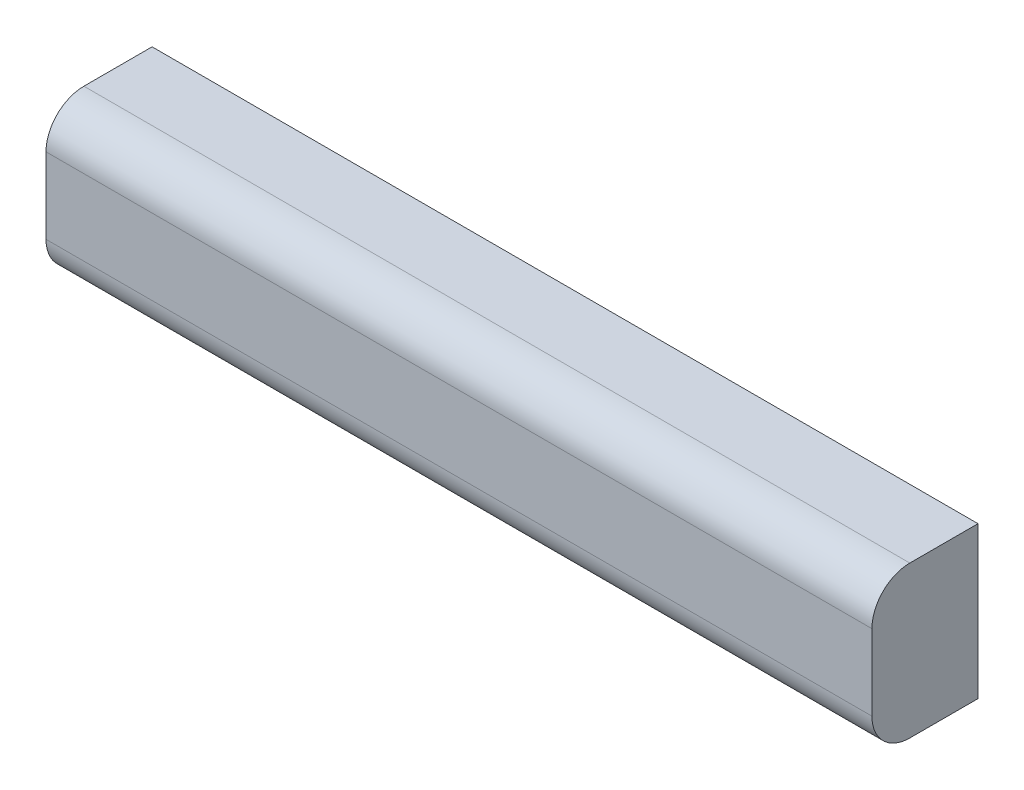
ISO-10303-21;
HEADER;
FILE_DESCRIPTION(('STEP AP214'),'2;1');
FILE_NAME('part.step','',(''),(''),'','','');
FILE_SCHEMA(('AUTOMOTIVE_DESIGN { 1 0 10303 214 1 1 1 1 }'));
ENDSEC;
DATA;
#1=APPLICATION_CONTEXT('core data for automotive mechanical design processes');
#2=APPLICATION_PROTOCOL_DEFINITION('international standard','automotive_design',2000,#1);
#3=PRODUCT_CONTEXT('',#1,'mechanical');
#4=PRODUCT('Part','Part','',(#3));
#5=PRODUCT_RELATED_PRODUCT_CATEGORY('part','',(#4));
#6=PRODUCT_DEFINITION_FORMATION('','',#4);
#7=PRODUCT_DEFINITION_CONTEXT('part definition',#1,'design');
#8=PRODUCT_DEFINITION('design','',#6,#7);
#9=PRODUCT_DEFINITION_SHAPE('','',#8);
#10=(LENGTH_UNIT() NAMED_UNIT(*) SI_UNIT(.MILLI.,.METRE.));
#11=(NAMED_UNIT(*) PLANE_ANGLE_UNIT() SI_UNIT($,.RADIAN.));
#12=(NAMED_UNIT(*) SI_UNIT($,.STERADIAN.) SOLID_ANGLE_UNIT());
#13=UNCERTAINTY_MEASURE_WITH_UNIT(LENGTH_MEASURE(1.E-05),#10,'distance_accuracy_value','');
#14=(GEOMETRIC_REPRESENTATION_CONTEXT(3) GLOBAL_UNCERTAINTY_ASSIGNED_CONTEXT((#13)) GLOBAL_UNIT_ASSIGNED_CONTEXT((#10,
#11,#12)) REPRESENTATION_CONTEXT('',''));
#15=CARTESIAN_POINT('',(0.,0.,0.));
#16=DIRECTION('',(0.,0.,1.));
#17=DIRECTION('',(1.,0.,0.));
#18=AXIS2_PLACEMENT_3D('',#15,#16,#17);
#19=CARTESIAN_POINT('',(346.075,63.5,44.45));
#20=DIRECTION('',(-1.,0.,0.));
#21=DIRECTION('',(0.,0.,1.));
#22=AXIS2_PLACEMENT_3D('',#19,#20,#21);
#23=PLANE('',#22);
#24=DIRECTION('',(0.,1.,0.));
#25=VECTOR('',#24,1.);
#26=CARTESIAN_POINT('',(346.075,63.5,44.45));
#27=LINE('',#26,#25);
#28=CARTESIAN_POINT('',(346.075,-31.75,44.45));
#29=VERTEX_POINT('',#28);
#30=CARTESIAN_POINT('',(346.075,31.75,44.45));
#31=VERTEX_POINT('',#30);
#32=EDGE_CURVE('E121',#29,#31,#27,.T.);
#33=ORIENTED_EDGE('',*,*,#32,.F.);
#34=CARTESIAN_POINT('',(346.075,-31.75,12.7));
#35=DIRECTION('',(-1.,0.,0.));
#36=DIRECTION('',(0.,0.,1.));
#37=AXIS2_PLACEMENT_3D('',#34,#35,#36);
#38=CIRCLE('',#37,31.75);
#39=CARTESIAN_POINT('',(346.075,-63.5,12.7));
#40=VERTEX_POINT('',#39);
#41=EDGE_CURVE('E133',#29,#40,#38,.F.);
#42=ORIENTED_EDGE('',*,*,#41,.T.);
#43=DIRECTION('',(0.,0.,-1.));
#44=VECTOR('',#43,1.);
#45=CARTESIAN_POINT('',(346.075,-63.5,44.45));
#46=LINE('',#45,#44);
#47=CARTESIAN_POINT('',(346.075,-63.5,-44.45));
#48=VERTEX_POINT('',#47);
#49=EDGE_CURVE('E107',#40,#48,#46,.T.);
#50=ORIENTED_EDGE('',*,*,#49,.T.);
#51=DIRECTION('',(0.,1.,0.));
#52=VECTOR('',#51,1.);
#53=CARTESIAN_POINT('',(346.075,63.5,-44.45));
#54=LINE('',#53,#52);
#55=CARTESIAN_POINT('',(346.075,63.5,-44.45));
#56=VERTEX_POINT('',#55);
#57=EDGE_CURVE('E102',#48,#56,#54,.T.);
#58=ORIENTED_EDGE('',*,*,#57,.T.);
#59=DIRECTION('',(0.,0.,-1.));
#60=VECTOR('',#59,1.);
#61=CARTESIAN_POINT('',(346.075,63.5,44.45));
#62=LINE('',#61,#60);
#63=CARTESIAN_POINT('',(346.075,63.5,12.7));
#64=VERTEX_POINT('',#63);
#65=EDGE_CURVE('E86',#64,#56,#62,.T.);
#66=ORIENTED_EDGE('',*,*,#65,.F.);
#67=CARTESIAN_POINT('',(346.075,31.75,12.7));
#68=DIRECTION('',(-1.,0.,0.));
#69=DIRECTION('',(0.,0.,1.));
#70=AXIS2_PLACEMENT_3D('',#67,#68,#69);
#71=CIRCLE('',#70,31.75);
#72=EDGE_CURVE('E131',#64,#31,#71,.F.);
#73=ORIENTED_EDGE('',*,*,#72,.T.);
#74=EDGE_LOOP('',(#33,#42,#50,#58,#66,#73));
#75=FACE_BOUND('',#74,.T.);
#76=ADVANCED_FACE('F33',(#75),#23,.F.);
#77=CARTESIAN_POINT('',(-346.075,63.5,44.45));
#78=DIRECTION('',(0.,-1.,0.));
#79=DIRECTION('',(0.,0.,-1.));
#80=AXIS2_PLACEMENT_3D('',#77,#78,#79);
#81=PLANE('',#80);
#82=DIRECTION('',(0.,0.,-1.));
#83=VECTOR('',#82,1.);
#84=CARTESIAN_POINT('',(-346.075,63.5,44.45));
#85=LINE('',#84,#83);
#86=CARTESIAN_POINT('',(-346.075,63.5,12.7));
#87=VERTEX_POINT('',#86);
#88=CARTESIAN_POINT('',(-346.075,63.5,-44.45));
#89=VERTEX_POINT('',#88);
#90=EDGE_CURVE('E96',#87,#89,#85,.T.);
#91=ORIENTED_EDGE('',*,*,#90,.F.);
#92=DIRECTION('',(-1.,0.,0.));
#93=VECTOR('',#92,1.);
#94=CARTESIAN_POINT('',(346.075,63.5,12.7));
#95=LINE('',#94,#93);
#96=EDGE_CURVE('E11',#87,#64,#95,.F.);
#97=ORIENTED_EDGE('',*,*,#96,.T.);
#98=ORIENTED_EDGE('',*,*,#65,.T.);
#99=DIRECTION('',(-1.,0.,0.));
#100=VECTOR('',#99,1.);
#101=CARTESIAN_POINT('',(-346.075,63.5,-44.45));
#102=LINE('',#101,#100);
#103=EDGE_CURVE('E89',#56,#89,#102,.T.);
#104=ORIENTED_EDGE('',*,*,#103,.T.);
#105=EDGE_LOOP('',(#91,#97,#98,#104));
#106=FACE_BOUND('',#105,.T.);
#107=ADVANCED_FACE('F88',(#106),#81,.F.);
#108=CARTESIAN_POINT('',(-346.075,63.5,44.45));
#109=DIRECTION('',(1.,0.,0.));
#110=DIRECTION('',(0.,0.,-1.));
#111=AXIS2_PLACEMENT_3D('',#108,#109,#110);
#112=PLANE('',#111);
#113=DIRECTION('',(0.,0.,-1.));
#114=VECTOR('',#113,1.);
#115=CARTESIAN_POINT('',(-346.075,-63.5,44.45));
#116=LINE('',#115,#114);
#117=CARTESIAN_POINT('',(-346.075,-63.5,12.7));
#118=VERTEX_POINT('',#117);
#119=CARTESIAN_POINT('',(-346.075,-63.5,-44.45));
#120=VERTEX_POINT('',#119);
#121=EDGE_CURVE('E123',#118,#120,#116,.T.);
#122=ORIENTED_EDGE('',*,*,#121,.F.);
#123=CARTESIAN_POINT('',(-346.075,-31.75,12.7));
#124=DIRECTION('',(1.,0.,0.));
#125=DIRECTION('',(0.,0.,-1.));
#126=AXIS2_PLACEMENT_3D('',#123,#124,#125);
#127=CIRCLE('',#126,31.75);
#128=CARTESIAN_POINT('',(-346.075,-31.75,44.45));
#129=VERTEX_POINT('',#128);
#130=EDGE_CURVE('E41',#118,#129,#127,.F.);
#131=ORIENTED_EDGE('',*,*,#130,.T.);
#132=DIRECTION('',(0.,-1.,0.));
#133=VECTOR('',#132,1.);
#134=CARTESIAN_POINT('',(-346.075,63.5,44.45));
#135=LINE('',#134,#133);
#136=CARTESIAN_POINT('',(-346.075,31.75,44.45));
#137=VERTEX_POINT('',#136);
#138=EDGE_CURVE('E115',#137,#129,#135,.T.);
#139=ORIENTED_EDGE('',*,*,#138,.F.);
#140=CARTESIAN_POINT('',(-346.075,31.75,12.7));
#141=DIRECTION('',(1.,0.,0.));
#142=DIRECTION('',(0.,0.,-1.));
#143=AXIS2_PLACEMENT_3D('',#140,#141,#142);
#144=CIRCLE('',#143,31.75);
#145=EDGE_CURVE('E48',#137,#87,#144,.F.);
#146=ORIENTED_EDGE('',*,*,#145,.T.);
#147=ORIENTED_EDGE('',*,*,#90,.T.);
#148=DIRECTION('',(0.,-1.,0.));
#149=VECTOR('',#148,1.);
#150=CARTESIAN_POINT('',(-346.075,63.5,-44.45));
#151=LINE('',#150,#149);
#152=EDGE_CURVE('E104',#89,#120,#151,.T.);
#153=ORIENTED_EDGE('',*,*,#152,.T.);
#154=EDGE_LOOP('',(#122,#131,#139,#146,#147,#153));
#155=FACE_BOUND('',#154,.T.);
#156=ADVANCED_FACE('F138',(#155),#112,.F.);
#157=CARTESIAN_POINT('',(-346.075,-63.5,44.45));
#158=DIRECTION('',(0.,1.,0.));
#159=DIRECTION('',(0.,0.,1.));
#160=AXIS2_PLACEMENT_3D('',#157,#158,#159);
#161=PLANE('',#160);
#162=ORIENTED_EDGE('',*,*,#49,.F.);
#163=DIRECTION('',(1.,0.,0.));
#164=VECTOR('',#163,1.);
#165=CARTESIAN_POINT('',(-346.075,-63.5,12.7));
#166=LINE('',#165,#164);
#167=EDGE_CURVE('E56',#40,#118,#166,.F.);
#168=ORIENTED_EDGE('',*,*,#167,.T.);
#169=ORIENTED_EDGE('',*,*,#121,.T.);
#170=DIRECTION('',(1.,0.,0.));
#171=VECTOR('',#170,1.);
#172=CARTESIAN_POINT('',(-346.075,-63.5,-44.45));
#173=LINE('',#172,#171);
#174=EDGE_CURVE('E119',#120,#48,#173,.T.);
#175=ORIENTED_EDGE('',*,*,#174,.T.);
#176=EDGE_LOOP('',(#162,#168,#169,#175));
#177=FACE_BOUND('',#176,.T.);
#178=ADVANCED_FACE('F146',(#177),#161,.F.);
#179=CARTESIAN_POINT('',(0.,0.,44.45));
#180=DIRECTION('',(0.,0.,1.));
#181=DIRECTION('',(1.,0.,0.));
#182=AXIS2_PLACEMENT_3D('',#179,#180,#181);
#183=PLANE('',#182);
#184=ORIENTED_EDGE('',*,*,#138,.T.);
#185=DIRECTION('',(1.,0.,0.));
#186=VECTOR('',#185,1.);
#187=CARTESIAN_POINT('',(346.075,-31.75,44.45));
#188=LINE('',#187,#186);
#189=EDGE_CURVE('E128',#129,#29,#188,.T.);
#190=ORIENTED_EDGE('',*,*,#189,.T.);
#191=ORIENTED_EDGE('',*,*,#32,.T.);
#192=DIRECTION('',(-1.,0.,0.));
#193=VECTOR('',#192,1.);
#194=CARTESIAN_POINT('',(-346.075,31.75,44.45));
#195=LINE('',#194,#193);
#196=EDGE_CURVE('E95',#31,#137,#195,.T.);
#197=ORIENTED_EDGE('',*,*,#196,.T.);
#198=EDGE_LOOP('',(#184,#190,#191,#197));
#199=FACE_BOUND('',#198,.T.);
#200=ADVANCED_FACE('F142',(#199),#183,.T.);
#201=CARTESIAN_POINT('',(0.,0.,-44.45));
#202=DIRECTION('',(0.,0.,1.));
#203=DIRECTION('',(1.,0.,0.));
#204=AXIS2_PLACEMENT_3D('',#201,#202,#203);
#205=PLANE('',#204);
#206=CARTESIAN_POINT('',(-183.367933996516,0.,-44.45));
#207=DIRECTION('',(0.,0.,-1.));
#208=DIRECTION('',(1.,0.,0.));
#209=AXIS2_PLACEMENT_3D('',#206,#207,#208);
#210=CIRCLE('',#209,4.76250000000001);
#211=CARTESIAN_POINT('',(-178.605433996516,0.,-44.45));
#212=VERTEX_POINT('',#211);
#213=EDGE_CURVE('E176',#212,#212,#210,.T.);
#214=ORIENTED_EDGE('',*,*,#213,.F.);
#215=EDGE_LOOP('',(#214));
#216=FACE_BOUND('',#215,.T.);
#217=CARTESIAN_POINT('',(183.367933996516,0.,-44.45));
#218=DIRECTION('',(0.,0.,-1.));
#219=DIRECTION('',(-1.,0.,0.));
#220=AXIS2_PLACEMENT_3D('',#217,#218,#219);
#221=CIRCLE('',#220,4.76250000000001);
#222=CARTESIAN_POINT('',(178.605433996516,0.,-44.45));
#223=VERTEX_POINT('',#222);
#224=EDGE_CURVE('E170',#223,#223,#221,.T.);
#225=ORIENTED_EDGE('',*,*,#224,.F.);
#226=EDGE_LOOP('',(#225));
#227=FACE_BOUND('',#226,.T.);
#228=CARTESIAN_POINT('',(157.967933996516,0.,-44.45));
#229=DIRECTION('',(0.,0.,-1.));
#230=DIRECTION('',(-1.,0.,0.));
#231=AXIS2_PLACEMENT_3D('',#228,#229,#230);
#232=CIRCLE('',#231,4.76250000000001);
#233=CARTESIAN_POINT('',(153.205433996516,0.,-44.45));
#234=VERTEX_POINT('',#233);
#235=EDGE_CURVE('E164',#234,#234,#232,.T.);
#236=ORIENTED_EDGE('',*,*,#235,.F.);
#237=EDGE_LOOP('',(#236));
#238=FACE_BOUND('',#237,.T.);
#239=CARTESIAN_POINT('',(-157.967933996516,0.,-44.45));
#240=DIRECTION('',(0.,0.,-1.));
#241=DIRECTION('',(1.,0.,0.));
#242=AXIS2_PLACEMENT_3D('',#239,#240,#241);
#243=CIRCLE('',#242,4.76250000000001);
#244=CARTESIAN_POINT('',(-153.205433996516,0.,-44.45));
#245=VERTEX_POINT('',#244);
#246=EDGE_CURVE('E158',#245,#245,#243,.T.);
#247=ORIENTED_EDGE('',*,*,#246,.F.);
#248=EDGE_LOOP('',(#247));
#249=FACE_BOUND('',#248,.T.);
#250=CARTESIAN_POINT('',(12.7,0.,-44.45));
#251=DIRECTION('',(0.,0.,-1.));
#252=DIRECTION('',(-1.,0.,0.));
#253=AXIS2_PLACEMENT_3D('',#250,#251,#252);
#254=CIRCLE('',#253,4.7625);
#255=CARTESIAN_POINT('',(7.9375,0.,-44.45));
#256=VERTEX_POINT('',#255);
#257=EDGE_CURVE('E152',#256,#256,#254,.T.);
#258=ORIENTED_EDGE('',*,*,#257,.F.);
#259=EDGE_LOOP('',(#258));
#260=FACE_BOUND('',#259,.T.);
#261=CARTESIAN_POINT('',(-12.7,0.,-44.45));
#262=DIRECTION('',(0.,0.,-1.));
#263=DIRECTION('',(-1.,0.,0.));
#264=AXIS2_PLACEMENT_3D('',#261,#262,#263);
#265=CIRCLE('',#264,4.7625);
#266=CARTESIAN_POINT('',(-17.4625,0.,-44.45));
#267=VERTEX_POINT('',#266);
#268=EDGE_CURVE('E112',#267,#267,#265,.T.);
#269=ORIENTED_EDGE('',*,*,#268,.F.);
#270=EDGE_LOOP('',(#269));
#271=FACE_BOUND('',#270,.T.);
#272=ORIENTED_EDGE('',*,*,#57,.F.);
#273=ORIENTED_EDGE('',*,*,#174,.F.);
#274=ORIENTED_EDGE('',*,*,#152,.F.);
#275=ORIENTED_EDGE('',*,*,#103,.F.);
#276=EDGE_LOOP('',(#272,#273,#274,#275));
#277=FACE_BOUND('',#276,.T.);
#278=ADVANCED_FACE('F100',(#216,#227,#238,#249,#260,#271,#277),#205,.F.);
#279=CARTESIAN_POINT('',(0.,-31.75,12.7));
#280=DIRECTION('',(-1.,0.,0.));
#281=DIRECTION('',(0.,0.,1.));
#282=AXIS2_PLACEMENT_3D('',#279,#280,#281);
#283=CYLINDRICAL_SURFACE('',#282,31.75);
#284=ORIENTED_EDGE('',*,*,#130,.F.);
#285=ORIENTED_EDGE('',*,*,#167,.F.);
#286=ORIENTED_EDGE('',*,*,#41,.F.);
#287=ORIENTED_EDGE('',*,*,#189,.F.);
#288=EDGE_LOOP('',(#284,#285,#286,#287));
#289=FACE_BOUND('',#288,.T.);
#290=ADVANCED_FACE('F145',(#289),#283,.T.);
#291=CARTESIAN_POINT('',(0.,31.75,12.7));
#292=DIRECTION('',(1.,0.,0.));
#293=DIRECTION('',(0.,0.,-1.));
#294=AXIS2_PLACEMENT_3D('',#291,#292,#293);
#295=CYLINDRICAL_SURFACE('',#294,31.75);
#296=ORIENTED_EDGE('',*,*,#72,.F.);
#297=ORIENTED_EDGE('',*,*,#96,.F.);
#298=ORIENTED_EDGE('',*,*,#145,.F.);
#299=ORIENTED_EDGE('',*,*,#196,.F.);
#300=EDGE_LOOP('',(#296,#297,#298,#299));
#301=FACE_BOUND('',#300,.T.);
#302=ADVANCED_FACE('F35',(#301),#295,.T.);
#303=CARTESIAN_POINT('',(-12.7,0.,-19.05));
#304=DIRECTION('',(0.,0.,-1.));
#305=DIRECTION('',(-1.,0.,0.));
#306=AXIS2_PLACEMENT_3D('',#303,#304,#305);
#307=CYLINDRICAL_SURFACE('',#306,4.7625);
#308=CARTESIAN_POINT('',(-12.7,0.,-19.05));
#309=DIRECTION('',(0.,0.,-1.));
#310=DIRECTION('',(-1.,0.,0.));
#311=AXIS2_PLACEMENT_3D('',#308,#309,#310);
#312=CIRCLE('',#311,4.7625);
#313=CARTESIAN_POINT('',(-17.4625,0.,-19.05));
#314=VERTEX_POINT('',#313);
#315=EDGE_CURVE('E109',#314,#314,#312,.T.);
#316=ORIENTED_EDGE('',*,*,#315,.F.);
#317=EDGE_LOOP('',(#316));
#318=FACE_BOUND('',#317,.T.);
#319=ORIENTED_EDGE('',*,*,#268,.T.);
#320=EDGE_LOOP('',(#319));
#321=FACE_BOUND('',#320,.T.);
#322=ADVANCED_FACE('F204',(#318,#321),#307,.F.);
#323=CARTESIAN_POINT('',(-12.7,0.,-19.05));
#324=DIRECTION('',(0.,0.,-1.));
#325=DIRECTION('',(-1.,0.,0.));
#326=AXIS2_PLACEMENT_3D('',#323,#324,#325);
#327=PLANE('',#326);
#328=ORIENTED_EDGE('',*,*,#315,.T.);
#329=EDGE_LOOP('',(#328));
#330=FACE_BOUND('',#329,.T.);
#331=ADVANCED_FACE('F206',(#330),#327,.T.);
#332=CARTESIAN_POINT('',(12.7,0.,-19.05));
#333=DIRECTION('',(0.,0.,-1.));
#334=DIRECTION('',(-1.,0.,0.));
#335=AXIS2_PLACEMENT_3D('',#332,#333,#334);
#336=CYLINDRICAL_SURFACE('',#335,4.7625);
#337=CARTESIAN_POINT('',(12.7,0.,-19.05));
#338=DIRECTION('',(0.,0.,-1.));
#339=DIRECTION('',(-1.,0.,0.));
#340=AXIS2_PLACEMENT_3D('',#337,#338,#339);
#341=CIRCLE('',#340,4.7625);
#342=CARTESIAN_POINT('',(7.9375,0.,-19.05));
#343=VERTEX_POINT('',#342);
#344=EDGE_CURVE('E150',#343,#343,#341,.T.);
#345=ORIENTED_EDGE('',*,*,#344,.F.);
#346=EDGE_LOOP('',(#345));
#347=FACE_BOUND('',#346,.T.);
#348=ORIENTED_EDGE('',*,*,#257,.T.);
#349=EDGE_LOOP('',(#348));
#350=FACE_BOUND('',#349,.T.);
#351=ADVANCED_FACE('F213',(#347,#350),#336,.F.);
#352=CARTESIAN_POINT('',(12.7,0.,-19.05));
#353=DIRECTION('',(0.,0.,-1.));
#354=DIRECTION('',(-1.,0.,0.));
#355=AXIS2_PLACEMENT_3D('',#352,#353,#354);
#356=PLANE('',#355);
#357=ORIENTED_EDGE('',*,*,#344,.T.);
#358=EDGE_LOOP('',(#357));
#359=FACE_BOUND('',#358,.T.);
#360=ADVANCED_FACE('F260',(#359),#356,.T.);
#361=CARTESIAN_POINT('',(-157.967933996516,0.,-19.05));
#362=DIRECTION('',(0.,0.,-1.));
#363=DIRECTION('',(-1.,0.,0.));
#364=AXIS2_PLACEMENT_3D('',#361,#362,#363);
#365=CYLINDRICAL_SURFACE('',#364,4.76250000000001);
#366=CARTESIAN_POINT('',(-157.967933996516,0.,-19.05));
#367=DIRECTION('',(0.,0.,-1.));
#368=DIRECTION('',(1.,0.,0.));
#369=AXIS2_PLACEMENT_3D('',#366,#367,#368);
#370=CIRCLE('',#369,4.76250000000001);
#371=CARTESIAN_POINT('',(-153.205433996516,0.,-19.05));
#372=VERTEX_POINT('',#371);
#373=EDGE_CURVE('E155',#372,#372,#370,.T.);
#374=ORIENTED_EDGE('',*,*,#373,.F.);
#375=EDGE_LOOP('',(#374));
#376=FACE_BOUND('',#375,.T.);
#377=ORIENTED_EDGE('',*,*,#246,.T.);
#378=EDGE_LOOP('',(#377));
#379=FACE_BOUND('',#378,.T.);
#380=ADVANCED_FACE('F270',(#376,#379),#365,.F.);
#381=CARTESIAN_POINT('',(-157.967933996516,0.,-19.05));
#382=DIRECTION('',(0.,0.,1.));
#383=DIRECTION('',(1.,0.,0.));
#384=AXIS2_PLACEMENT_3D('',#381,#382,#383);
#385=PLANE('',#384);
#386=ORIENTED_EDGE('',*,*,#373,.T.);
#387=EDGE_LOOP('',(#386));
#388=FACE_BOUND('',#387,.T.);
#389=ADVANCED_FACE('F280',(#388),#385,.F.);
#390=CARTESIAN_POINT('',(157.967933996516,0.,-19.05));
#391=DIRECTION('',(0.,0.,-1.));
#392=DIRECTION('',(-1.,0.,0.));
#393=AXIS2_PLACEMENT_3D('',#390,#391,#392);
#394=CYLINDRICAL_SURFACE('',#393,4.76250000000001);
#395=CARTESIAN_POINT('',(157.967933996516,0.,-19.05));
#396=DIRECTION('',(0.,0.,-1.));
#397=DIRECTION('',(-1.,0.,0.));
#398=AXIS2_PLACEMENT_3D('',#395,#396,#397);
#399=CIRCLE('',#398,4.76250000000001);
#400=CARTESIAN_POINT('',(153.205433996516,0.,-19.05));
#401=VERTEX_POINT('',#400);
#402=EDGE_CURVE('E161',#401,#401,#399,.T.);
#403=ORIENTED_EDGE('',*,*,#402,.F.);
#404=EDGE_LOOP('',(#403));
#405=FACE_BOUND('',#404,.T.);
#406=ORIENTED_EDGE('',*,*,#235,.T.);
#407=EDGE_LOOP('',(#406));
#408=FACE_BOUND('',#407,.T.);
#409=ADVANCED_FACE('F290',(#405,#408),#394,.F.);
#410=CARTESIAN_POINT('',(157.967933996516,0.,-19.05));
#411=DIRECTION('',(0.,0.,-1.));
#412=DIRECTION('',(-1.,0.,0.));
#413=AXIS2_PLACEMENT_3D('',#410,#411,#412);
#414=PLANE('',#413);
#415=ORIENTED_EDGE('',*,*,#402,.T.);
#416=EDGE_LOOP('',(#415));
#417=FACE_BOUND('',#416,.T.);
#418=ADVANCED_FACE('F300',(#417),#414,.T.);
#419=CARTESIAN_POINT('',(183.367933996516,0.,-19.05));
#420=DIRECTION('',(0.,0.,-1.));
#421=DIRECTION('',(-1.,0.,0.));
#422=AXIS2_PLACEMENT_3D('',#419,#420,#421);
#423=CYLINDRICAL_SURFACE('',#422,4.76250000000001);
#424=CARTESIAN_POINT('',(183.367933996516,0.,-19.05));
#425=DIRECTION('',(0.,0.,-1.));
#426=DIRECTION('',(-1.,0.,0.));
#427=AXIS2_PLACEMENT_3D('',#424,#425,#426);
#428=CIRCLE('',#427,4.76250000000001);
#429=CARTESIAN_POINT('',(178.605433996516,0.,-19.05));
#430=VERTEX_POINT('',#429);
#431=EDGE_CURVE('E167',#430,#430,#428,.T.);
#432=ORIENTED_EDGE('',*,*,#431,.F.);
#433=EDGE_LOOP('',(#432));
#434=FACE_BOUND('',#433,.T.);
#435=ORIENTED_EDGE('',*,*,#224,.T.);
#436=EDGE_LOOP('',(#435));
#437=FACE_BOUND('',#436,.T.);
#438=ADVANCED_FACE('F310',(#434,#437),#423,.F.);
#439=CARTESIAN_POINT('',(183.367933996516,0.,-19.05));
#440=DIRECTION('',(0.,0.,-1.));
#441=DIRECTION('',(-1.,0.,0.));
#442=AXIS2_PLACEMENT_3D('',#439,#440,#441);
#443=PLANE('',#442);
#444=ORIENTED_EDGE('',*,*,#431,.T.);
#445=EDGE_LOOP('',(#444));
#446=FACE_BOUND('',#445,.T.);
#447=ADVANCED_FACE('F187',(#446),#443,.T.);
#448=CARTESIAN_POINT('',(-183.367933996516,0.,-19.05));
#449=DIRECTION('',(0.,0.,-1.));
#450=DIRECTION('',(-1.,0.,0.));
#451=AXIS2_PLACEMENT_3D('',#448,#449,#450);
#452=CYLINDRICAL_SURFACE('',#451,4.76250000000001);
#453=CARTESIAN_POINT('',(-183.367933996516,0.,-19.05));
#454=DIRECTION('',(0.,0.,-1.));
#455=DIRECTION('',(1.,0.,0.));
#456=AXIS2_PLACEMENT_3D('',#453,#454,#455);
#457=CIRCLE('',#456,4.76250000000001);
#458=CARTESIAN_POINT('',(-178.605433996516,0.,-19.05));
#459=VERTEX_POINT('',#458);
#460=EDGE_CURVE('E173',#459,#459,#457,.T.);
#461=ORIENTED_EDGE('',*,*,#460,.F.);
#462=EDGE_LOOP('',(#461));
#463=FACE_BOUND('',#462,.T.);
#464=ORIENTED_EDGE('',*,*,#213,.T.);
#465=EDGE_LOOP('',(#464));
#466=FACE_BOUND('',#465,.T.);
#467=ADVANCED_FACE('F184',(#463,#466),#452,.F.);
#468=CARTESIAN_POINT('',(-183.367933996516,0.,-19.05));
#469=DIRECTION('',(0.,0.,1.));
#470=DIRECTION('',(1.,0.,0.));
#471=AXIS2_PLACEMENT_3D('',#468,#469,#470);
#472=PLANE('',#471);
#473=ORIENTED_EDGE('',*,*,#460,.T.);
#474=EDGE_LOOP('',(#473));
#475=FACE_BOUND('',#474,.T.);
#476=ADVANCED_FACE('F182',(#475),#472,.F.);
#477=CLOSED_SHELL('',(#76,#107,#156,#178,#200,#278,#290,#302,#322,#331,#351,#360,#380,#389,#409,
#418,#438,#447,#467,#476));
#478=MANIFOLD_SOLID_BREP('B2',#477);
#479=ADVANCED_BREP_SHAPE_REPRESENTATION('',(#18,#478),#14);
#480=SHAPE_DEFINITION_REPRESENTATION(#9,#479);
ENDSEC;
END-ISO-10303-21;
